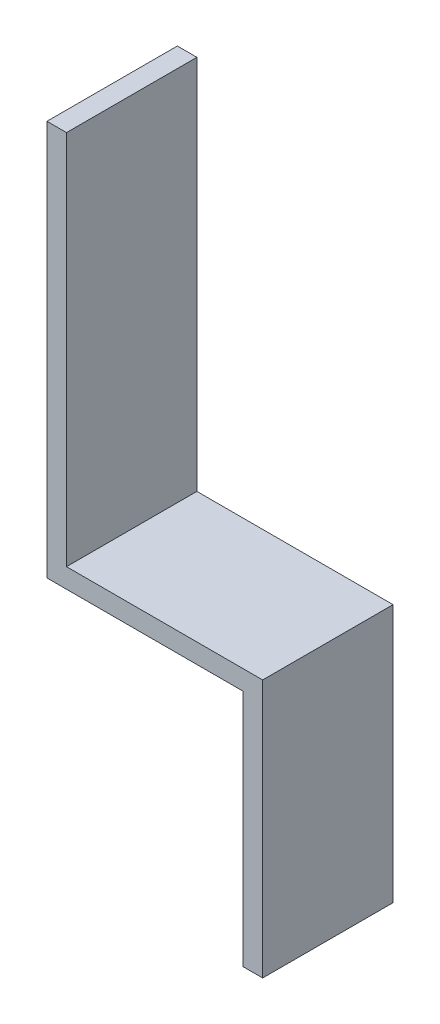
ISO-10303-21;
HEADER;
FILE_DESCRIPTION(('STEP AP214'),'2;1');
FILE_NAME('part.step','',(''),(''),'','','');
FILE_SCHEMA(('AUTOMOTIVE_DESIGN { 1 0 10303 214 1 1 1 1 }'));
ENDSEC;
DATA;
#1=APPLICATION_CONTEXT('core data for automotive mechanical design processes');
#2=APPLICATION_PROTOCOL_DEFINITION('international standard','automotive_design',2000,#1);
#3=PRODUCT_CONTEXT('',#1,'mechanical');
#4=PRODUCT('Part','Part','',(#3));
#5=PRODUCT_RELATED_PRODUCT_CATEGORY('part','',(#4));
#6=PRODUCT_DEFINITION_FORMATION('','',#4);
#7=PRODUCT_DEFINITION_CONTEXT('part definition',#1,'design');
#8=PRODUCT_DEFINITION('design','',#6,#7);
#9=PRODUCT_DEFINITION_SHAPE('','',#8);
#10=(LENGTH_UNIT() NAMED_UNIT(*) SI_UNIT(.MILLI.,.METRE.));
#11=(NAMED_UNIT(*) PLANE_ANGLE_UNIT() SI_UNIT($,.RADIAN.));
#12=(NAMED_UNIT(*) SI_UNIT($,.STERADIAN.) SOLID_ANGLE_UNIT());
#13=UNCERTAINTY_MEASURE_WITH_UNIT(LENGTH_MEASURE(1.E-05),#10,'distance_accuracy_value','');
#14=(GEOMETRIC_REPRESENTATION_CONTEXT(3) GLOBAL_UNCERTAINTY_ASSIGNED_CONTEXT((#13)) GLOBAL_UNIT_ASSIGNED_CONTEXT((#10,
#11,#12)) REPRESENTATION_CONTEXT('',''));
#15=CARTESIAN_POINT('',(0.,0.,0.));
#16=DIRECTION('',(0.,0.,1.));
#17=DIRECTION('',(1.,0.,0.));
#18=AXIS2_PLACEMENT_3D('',#15,#16,#17);
#19=CARTESIAN_POINT('',(-33.0845383421613,-15.1097312505688,20.));
#20=DIRECTION('',(0.,1.,0.));
#21=DIRECTION('',(0.,0.,1.));
#22=AXIS2_PLACEMENT_3D('',#19,#20,#21);
#23=PLANE('',#22);
#24=DIRECTION('',(1.,0.,0.));
#25=VECTOR('',#24,1.);
#26=CARTESIAN_POINT('',(-33.0845383421613,-15.1097312505688,0.));
#27=LINE('',#26,#25);
#28=CARTESIAN_POINT('',(-33.0845383421613,-15.1097312505688,0.));
#29=VERTEX_POINT('',#28);
#30=CARTESIAN_POINT('',(-3.,-15.1097312505688,0.));
#31=VERTEX_POINT('',#30);
#32=EDGE_CURVE('E131',#29,#31,#27,.T.);
#33=ORIENTED_EDGE('',*,*,#32,.T.);
#34=DIRECTION('',(0.,0.,-1.));
#35=VECTOR('',#34,1.);
#36=CARTESIAN_POINT('',(-3.,-15.1097312505688,20.));
#37=LINE('',#36,#35);
#38=CARTESIAN_POINT('',(-3.,-15.1097312505688,20.));
#39=VERTEX_POINT('',#38);
#40=EDGE_CURVE('E11',#39,#31,#37,.T.);
#41=ORIENTED_EDGE('',*,*,#40,.F.);
#42=DIRECTION('',(1.,0.,0.));
#43=VECTOR('',#42,1.);
#44=CARTESIAN_POINT('',(-33.0845383421613,-15.1097312505688,20.));
#45=LINE('',#44,#43);
#46=CARTESIAN_POINT('',(-33.0845383421613,-15.1097312505688,20.));
#47=VERTEX_POINT('',#46);
#48=EDGE_CURVE('E145',#47,#39,#45,.T.);
#49=ORIENTED_EDGE('',*,*,#48,.F.);
#50=DIRECTION('',(0.,0.,-1.));
#51=VECTOR('',#50,1.);
#52=CARTESIAN_POINT('',(-33.0845383421613,-15.1097312505688,20.));
#53=LINE('',#52,#51);
#54=EDGE_CURVE('E127',#47,#29,#53,.T.);
#55=ORIENTED_EDGE('',*,*,#54,.T.);
#56=EDGE_LOOP('',(#33,#41,#49,#55));
#57=FACE_BOUND('',#56,.T.);
#58=ADVANCED_FACE('F35',(#57),#23,.F.);
#59=CARTESIAN_POINT('',(-3.,-15.1097312505688,20.));
#60=DIRECTION('',(1.,0.,0.));
#61=DIRECTION('',(0.,0.,-1.));
#62=AXIS2_PLACEMENT_3D('',#59,#60,#61);
#63=PLANE('',#62);
#64=DIRECTION('',(0.,-1.,0.));
#65=VECTOR('',#64,1.);
#66=CARTESIAN_POINT('',(-3.,-15.1097312505688,0.));
#67=LINE('',#66,#65);
#68=CARTESIAN_POINT('',(-3.,-51.7012422505688,0.));
#69=VERTEX_POINT('',#68);
#70=EDGE_CURVE('E134',#31,#69,#67,.T.);
#71=ORIENTED_EDGE('',*,*,#70,.T.);
#72=DIRECTION('',(0.,0.,-1.));
#73=VECTOR('',#72,1.);
#74=CARTESIAN_POINT('',(-3.,-51.7012422505688,20.));
#75=LINE('',#74,#73);
#76=CARTESIAN_POINT('',(-3.,-51.7012422505688,20.));
#77=VERTEX_POINT('',#76);
#78=EDGE_CURVE('E43',#77,#69,#75,.T.);
#79=ORIENTED_EDGE('',*,*,#78,.F.);
#80=DIRECTION('',(0.,-1.,0.));
#81=VECTOR('',#80,1.);
#82=CARTESIAN_POINT('',(-3.,-15.1097312505688,20.));
#83=LINE('',#82,#81);
#84=EDGE_CURVE('E94',#39,#77,#83,.T.);
#85=ORIENTED_EDGE('',*,*,#84,.F.);
#86=ORIENTED_EDGE('',*,*,#40,.T.);
#87=EDGE_LOOP('',(#71,#79,#85,#86));
#88=FACE_BOUND('',#87,.T.);
#89=ADVANCED_FACE('F180',(#88),#63,.F.);
#90=CARTESIAN_POINT('',(-3.,-51.7012422505688,20.));
#91=DIRECTION('',(0.,1.,0.));
#92=DIRECTION('',(0.,0.,1.));
#93=AXIS2_PLACEMENT_3D('',#90,#91,#92);
#94=PLANE('',#93);
#95=DIRECTION('',(1.,0.,0.));
#96=VECTOR('',#95,1.);
#97=CARTESIAN_POINT('',(-3.,-51.7012422505688,0.));
#98=LINE('',#97,#96);
#99=CARTESIAN_POINT('',(0.,-51.7012422505688,0.));
#100=VERTEX_POINT('',#99);
#101=EDGE_CURVE('E136',#69,#100,#98,.T.);
#102=ORIENTED_EDGE('',*,*,#101,.T.);
#103=DIRECTION('',(0.,0.,-1.));
#104=VECTOR('',#103,1.);
#105=CARTESIAN_POINT('',(0.,-51.7012422505688,20.));
#106=LINE('',#105,#104);
#107=CARTESIAN_POINT('',(0.,-51.7012422505688,20.));
#108=VERTEX_POINT('',#107);
#109=EDGE_CURVE('E152',#108,#100,#106,.T.);
#110=ORIENTED_EDGE('',*,*,#109,.F.);
#111=DIRECTION('',(1.,0.,0.));
#112=VECTOR('',#111,1.);
#113=CARTESIAN_POINT('',(-3.,-51.7012422505688,20.));
#114=LINE('',#113,#112);
#115=EDGE_CURVE('E160',#77,#108,#114,.T.);
#116=ORIENTED_EDGE('',*,*,#115,.F.);
#117=ORIENTED_EDGE('',*,*,#78,.T.);
#118=EDGE_LOOP('',(#102,#110,#116,#117));
#119=FACE_BOUND('',#118,.T.);
#120=ADVANCED_FACE('F158',(#119),#94,.F.);
#121=CARTESIAN_POINT('',(0.,-12.1097312505688,20.));
#122=DIRECTION('',(-1.,0.,0.));
#123=DIRECTION('',(0.,-1.,0.));
#124=AXIS2_PLACEMENT_3D('',#121,#122,#123);
#125=PLANE('',#124);
#126=DIRECTION('',(0.,1.,0.));
#127=VECTOR('',#126,1.);
#128=CARTESIAN_POINT('',(0.,-12.1097312505688,0.));
#129=LINE('',#128,#127);
#130=CARTESIAN_POINT('',(0.,-12.1097312505688,0.));
#131=VERTEX_POINT('',#130);
#132=EDGE_CURVE('E138',#100,#131,#129,.T.);
#133=ORIENTED_EDGE('',*,*,#132,.T.);
#134=DIRECTION('',(0.,0.,-1.));
#135=VECTOR('',#134,1.);
#136=CARTESIAN_POINT('',(0.,-12.1097312505688,20.));
#137=LINE('',#136,#135);
#138=CARTESIAN_POINT('',(0.,-12.1097312505688,20.));
#139=VERTEX_POINT('',#138);
#140=EDGE_CURVE('E149',#139,#131,#137,.T.);
#141=ORIENTED_EDGE('',*,*,#140,.F.);
#142=DIRECTION('',(0.,1.,0.));
#143=VECTOR('',#142,1.);
#144=CARTESIAN_POINT('',(0.,-12.1097312505688,20.));
#145=LINE('',#144,#143);
#146=EDGE_CURVE('E172',#108,#139,#145,.T.);
#147=ORIENTED_EDGE('',*,*,#146,.F.);
#148=ORIENTED_EDGE('',*,*,#109,.T.);
#149=EDGE_LOOP('',(#133,#141,#147,#148));
#150=FACE_BOUND('',#149,.T.);
#151=ADVANCED_FACE('F168',(#150),#125,.F.);
#152=CARTESIAN_POINT('',(0.,-12.1097312505688,20.));
#153=DIRECTION('',(0.,-1.,0.));
#154=DIRECTION('',(1.,0.,0.));
#155=AXIS2_PLACEMENT_3D('',#152,#153,#154);
#156=PLANE('',#155);
#157=DIRECTION('',(-1.,0.,0.));
#158=VECTOR('',#157,1.);
#159=CARTESIAN_POINT('',(0.,-12.1097312505688,0.));
#160=LINE('',#159,#158);
#161=CARTESIAN_POINT('',(-30.0845383421613,-12.1097312505688,0.));
#162=VERTEX_POINT('',#161);
#163=EDGE_CURVE('E140',#131,#162,#160,.T.);
#164=ORIENTED_EDGE('',*,*,#163,.T.);
#165=DIRECTION('',(0.,0.,-1.));
#166=VECTOR('',#165,1.);
#167=CARTESIAN_POINT('',(-30.0845383421613,-12.1097312505688,20.));
#168=LINE('',#167,#166);
#169=CARTESIAN_POINT('',(-30.0845383421613,-12.1097312505688,20.));
#170=VERTEX_POINT('',#169);
#171=EDGE_CURVE('E122',#170,#162,#168,.T.);
#172=ORIENTED_EDGE('',*,*,#171,.F.);
#173=DIRECTION('',(-1.,0.,0.));
#174=VECTOR('',#173,1.);
#175=CARTESIAN_POINT('',(0.,-12.1097312505688,20.));
#176=LINE('',#175,#174);
#177=EDGE_CURVE('E113',#139,#170,#176,.T.);
#178=ORIENTED_EDGE('',*,*,#177,.F.);
#179=ORIENTED_EDGE('',*,*,#140,.T.);
#180=EDGE_LOOP('',(#164,#172,#178,#179));
#181=FACE_BOUND('',#180,.T.);
#182=ADVANCED_FACE('F171',(#181),#156,.F.);
#183=CARTESIAN_POINT('',(-30.0845383421613,-12.1097312505688,20.));
#184=DIRECTION('',(-1.,0.,0.));
#185=DIRECTION('',(0.,0.,1.));
#186=AXIS2_PLACEMENT_3D('',#183,#184,#185);
#187=PLANE('',#186);
#188=DIRECTION('',(0.,1.,0.));
#189=VECTOR('',#188,1.);
#190=CARTESIAN_POINT('',(-30.0845383421613,-12.1097312505688,0.));
#191=LINE('',#190,#189);
#192=CARTESIAN_POINT('',(-30.0845383421613,45.5504066654615,0.));
#193=VERTEX_POINT('',#192);
#194=EDGE_CURVE('E121',#162,#193,#191,.T.);
#195=ORIENTED_EDGE('',*,*,#194,.T.);
#196=DIRECTION('',(0.,0.,-1.));
#197=VECTOR('',#196,1.);
#198=CARTESIAN_POINT('',(-30.0845383421613,45.5504066654615,20.));
#199=LINE('',#198,#197);
#200=CARTESIAN_POINT('',(-30.0845383421613,45.5504066654615,20.));
#201=VERTEX_POINT('',#200);
#202=EDGE_CURVE('E118',#201,#193,#199,.T.);
#203=ORIENTED_EDGE('',*,*,#202,.F.);
#204=DIRECTION('',(0.,1.,0.));
#205=VECTOR('',#204,1.);
#206=CARTESIAN_POINT('',(-30.0845383421613,-12.1097312505688,20.));
#207=LINE('',#206,#205);
#208=EDGE_CURVE('E107',#170,#201,#207,.T.);
#209=ORIENTED_EDGE('',*,*,#208,.F.);
#210=ORIENTED_EDGE('',*,*,#171,.T.);
#211=EDGE_LOOP('',(#195,#203,#209,#210));
#212=FACE_BOUND('',#211,.T.);
#213=ADVANCED_FACE('F119',(#212),#187,.F.);
#214=CARTESIAN_POINT('',(-30.0845383421613,45.5504066654615,20.));
#215=DIRECTION('',(0.,-1.,0.));
#216=DIRECTION('',(0.,0.,-1.));
#217=AXIS2_PLACEMENT_3D('',#214,#215,#216);
#218=PLANE('',#217);
#219=DIRECTION('',(-1.,0.,0.));
#220=VECTOR('',#219,1.);
#221=CARTESIAN_POINT('',(-30.0845383421613,45.5504066654615,0.));
#222=LINE('',#221,#220);
#223=CARTESIAN_POINT('',(-33.0845383421613,45.5504066654615,0.));
#224=VERTEX_POINT('',#223);
#225=EDGE_CURVE('E80',#193,#224,#222,.T.);
#226=ORIENTED_EDGE('',*,*,#225,.T.);
#227=DIRECTION('',(0.,0.,-1.));
#228=VECTOR('',#227,1.);
#229=CARTESIAN_POINT('',(-33.0845383421613,45.5504066654615,20.));
#230=LINE('',#229,#228);
#231=CARTESIAN_POINT('',(-33.0845383421613,45.5504066654615,20.));
#232=VERTEX_POINT('',#231);
#233=EDGE_CURVE('E123',#232,#224,#230,.T.);
#234=ORIENTED_EDGE('',*,*,#233,.F.);
#235=DIRECTION('',(-1.,0.,0.));
#236=VECTOR('',#235,1.);
#237=CARTESIAN_POINT('',(-30.0845383421613,45.5504066654615,20.));
#238=LINE('',#237,#236);
#239=EDGE_CURVE('E111',#201,#232,#238,.T.);
#240=ORIENTED_EDGE('',*,*,#239,.F.);
#241=ORIENTED_EDGE('',*,*,#202,.T.);
#242=EDGE_LOOP('',(#226,#234,#240,#241));
#243=FACE_BOUND('',#242,.T.);
#244=ADVANCED_FACE('F125',(#243),#218,.F.);
#245=CARTESIAN_POINT('',(-33.0845383421613,45.5504066654615,20.));
#246=DIRECTION('',(1.,0.,0.));
#247=DIRECTION('',(0.,1.,0.));
#248=AXIS2_PLACEMENT_3D('',#245,#246,#247);
#249=PLANE('',#248);
#250=DIRECTION('',(0.,-1.,0.));
#251=VECTOR('',#250,1.);
#252=CARTESIAN_POINT('',(-33.0845383421613,45.5504066654615,0.));
#253=LINE('',#252,#251);
#254=EDGE_CURVE('E86',#224,#29,#253,.T.);
#255=ORIENTED_EDGE('',*,*,#254,.T.);
#256=ORIENTED_EDGE('',*,*,#54,.F.);
#257=DIRECTION('',(0.,-1.,0.));
#258=VECTOR('',#257,1.);
#259=CARTESIAN_POINT('',(-33.0845383421613,45.5504066654615,20.));
#260=LINE('',#259,#258);
#261=EDGE_CURVE('E51',#232,#47,#260,.T.);
#262=ORIENTED_EDGE('',*,*,#261,.F.);
#263=ORIENTED_EDGE('',*,*,#233,.T.);
#264=EDGE_LOOP('',(#255,#256,#262,#263));
#265=FACE_BOUND('',#264,.T.);
#266=ADVANCED_FACE('F196',(#265),#249,.F.);
#267=CARTESIAN_POINT('',(0.,0.,20.));
#268=DIRECTION('',(0.,0.,-1.));
#269=DIRECTION('',(-1.,0.,0.));
#270=AXIS2_PLACEMENT_3D('',#267,#268,#269);
#271=PLANE('',#270);
#272=ORIENTED_EDGE('',*,*,#48,.T.);
#273=ORIENTED_EDGE('',*,*,#84,.T.);
#274=ORIENTED_EDGE('',*,*,#115,.T.);
#275=ORIENTED_EDGE('',*,*,#146,.T.);
#276=ORIENTED_EDGE('',*,*,#177,.T.);
#277=ORIENTED_EDGE('',*,*,#208,.T.);
#278=ORIENTED_EDGE('',*,*,#239,.T.);
#279=ORIENTED_EDGE('',*,*,#261,.T.);
#280=EDGE_LOOP('',(#272,#273,#274,#275,#276,#277,#278,#279));
#281=FACE_BOUND('',#280,.T.);
#282=ADVANCED_FACE('F109',(#281),#271,.F.);
#283=CARTESIAN_POINT('',(0.,0.,0.));
#284=DIRECTION('',(0.,0.,-1.));
#285=DIRECTION('',(-1.,0.,0.));
#286=AXIS2_PLACEMENT_3D('',#283,#284,#285);
#287=PLANE('',#286);
#288=ORIENTED_EDGE('',*,*,#32,.F.);
#289=ORIENTED_EDGE('',*,*,#254,.F.);
#290=ORIENTED_EDGE('',*,*,#225,.F.);
#291=ORIENTED_EDGE('',*,*,#194,.F.);
#292=ORIENTED_EDGE('',*,*,#163,.F.);
#293=ORIENTED_EDGE('',*,*,#132,.F.);
#294=ORIENTED_EDGE('',*,*,#101,.F.);
#295=ORIENTED_EDGE('',*,*,#70,.F.);
#296=EDGE_LOOP('',(#288,#289,#290,#291,#292,#293,#294,#295));
#297=FACE_BOUND('',#296,.T.);
#298=ADVANCED_FACE('F164',(#297),#287,.T.);
#299=CLOSED_SHELL('',(#58,#89,#120,#151,#182,#213,#244,#266,#282,#298));
#300=MANIFOLD_SOLID_BREP('B2',#299);
#301=ADVANCED_BREP_SHAPE_REPRESENTATION('',(#18,#300),#14);
#302=SHAPE_DEFINITION_REPRESENTATION(#9,#301);
ENDSEC;
END-ISO-10303-21;
